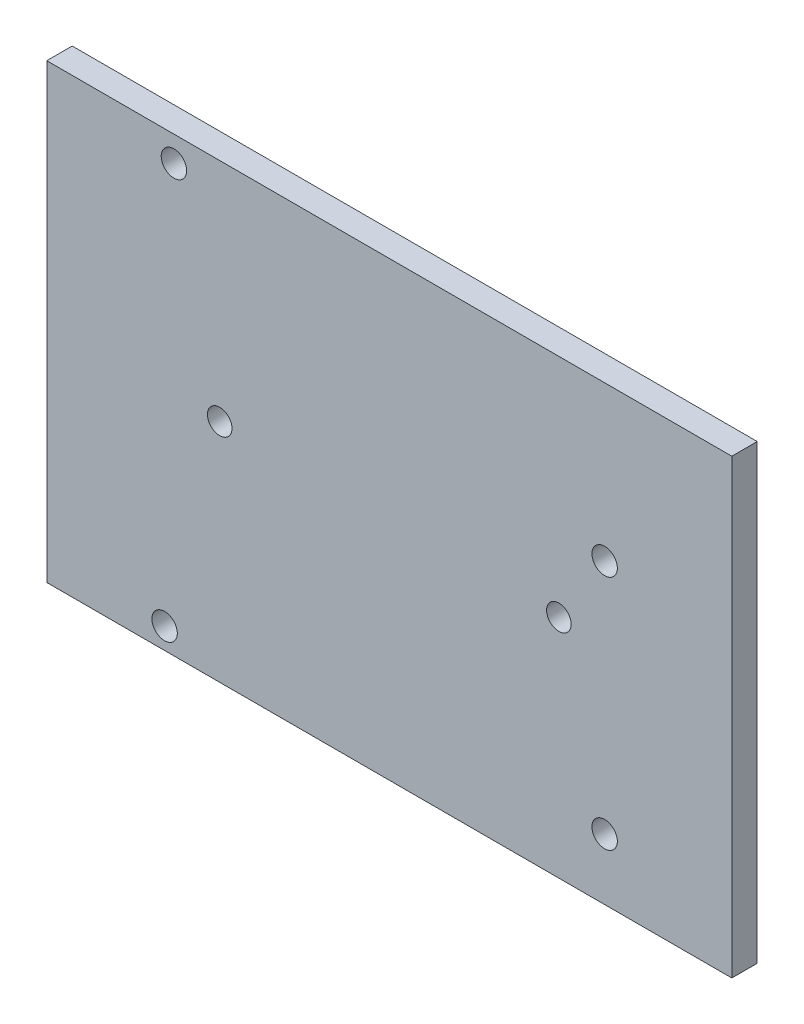
ISO-10303-21;
HEADER;
FILE_DESCRIPTION(('STEP AP214'),'2;1');
FILE_NAME('part.step','',(''),(''),'','','');
FILE_SCHEMA(('AUTOMOTIVE_DESIGN { 1 0 10303 214 1 1 1 1 }'));
ENDSEC;
DATA;
#1=APPLICATION_CONTEXT('core data for automotive mechanical design processes');
#2=APPLICATION_PROTOCOL_DEFINITION('international standard','automotive_design',2000,#1);
#3=PRODUCT_CONTEXT('',#1,'mechanical');
#4=PRODUCT('Part','Part','',(#3));
#5=PRODUCT_RELATED_PRODUCT_CATEGORY('part','',(#4));
#6=PRODUCT_DEFINITION_FORMATION('','',#4);
#7=PRODUCT_DEFINITION_CONTEXT('part definition',#1,'design');
#8=PRODUCT_DEFINITION('design','',#6,#7);
#9=PRODUCT_DEFINITION_SHAPE('','',#8);
#10=(LENGTH_UNIT() NAMED_UNIT(*) SI_UNIT(.MILLI.,.METRE.));
#11=(NAMED_UNIT(*) PLANE_ANGLE_UNIT() SI_UNIT($,.RADIAN.));
#12=(NAMED_UNIT(*) SI_UNIT($,.STERADIAN.) SOLID_ANGLE_UNIT());
#13=UNCERTAINTY_MEASURE_WITH_UNIT(LENGTH_MEASURE(1.E-05),#10,'distance_accuracy_value','');
#14=(GEOMETRIC_REPRESENTATION_CONTEXT(3) GLOBAL_UNCERTAINTY_ASSIGNED_CONTEXT((#13)) GLOBAL_UNIT_ASSIGNED_CONTEXT((#10,
#11,#12)) REPRESENTATION_CONTEXT('',''));
#15=CARTESIAN_POINT('',(0.,0.,0.));
#16=DIRECTION('',(0.,0.,1.));
#17=DIRECTION('',(1.,0.,0.));
#18=AXIS2_PLACEMENT_3D('',#15,#16,#17);
#19=CARTESIAN_POINT('',(0.,0.,3.));
#20=DIRECTION('',(0.,0.,1.));
#21=DIRECTION('',(1.,0.,0.));
#22=AXIS2_PLACEMENT_3D('',#19,#20,#21);
#23=PLANE('',#22);
#24=CARTESIAN_POINT('',(20.,0.,3.));
#25=DIRECTION('',(0.,0.,1.));
#26=DIRECTION('',(1.,0.,0.));
#27=AXIS2_PLACEMENT_3D('',#24,#25,#26);
#28=CIRCLE('',#27,1.45);
#29=CARTESIAN_POINT('',(21.45,0.,3.));
#30=VERTEX_POINT('',#29);
#31=EDGE_CURVE('E133',#30,#30,#28,.T.);
#32=ORIENTED_EDGE('',*,*,#31,.F.);
#33=EDGE_LOOP('',(#32));
#34=FACE_BOUND('',#33,.T.);
#35=CARTESIAN_POINT('',(25.4,-19.45,3.));
#36=DIRECTION('',(0.,0.,1.));
#37=DIRECTION('',(1.,0.,0.));
#38=AXIS2_PLACEMENT_3D('',#35,#36,#37);
#39=CIRCLE('',#38,1.5);
#40=CARTESIAN_POINT('',(26.9,-19.45,3.));
#41=VERTEX_POINT('',#40);
#42=EDGE_CURVE('E121',#41,#41,#39,.T.);
#43=ORIENTED_EDGE('',*,*,#42,.F.);
#44=EDGE_LOOP('',(#43));
#45=FACE_BOUND('',#44,.T.);
#46=CARTESIAN_POINT('',(-25.4,23.65,3.));
#47=DIRECTION('',(0.,0.,1.));
#48=DIRECTION('',(1.,0.,0.));
#49=AXIS2_PLACEMENT_3D('',#46,#47,#48);
#50=CIRCLE('',#49,1.5);
#51=CARTESIAN_POINT('',(-23.9,23.65,3.));
#52=VERTEX_POINT('',#51);
#53=EDGE_CURVE('E100',#52,#52,#50,.T.);
#54=ORIENTED_EDGE('',*,*,#53,.F.);
#55=EDGE_LOOP('',(#54));
#56=FACE_BOUND('',#55,.T.);
#57=DIRECTION('',(0.,-1.,0.));
#58=VECTOR('',#57,1.);
#59=CARTESIAN_POINT('',(-40.4,26.65,3.));
#60=LINE('',#59,#58);
#61=CARTESIAN_POINT('',(-40.4,26.65,3.));
#62=VERTEX_POINT('',#61);
#63=CARTESIAN_POINT('',(-40.4,-26.65,3.));
#64=VERTEX_POINT('',#63);
#65=EDGE_CURVE('E85',#62,#64,#60,.T.);
#66=ORIENTED_EDGE('',*,*,#65,.T.);
#67=DIRECTION('',(1.,0.,0.));
#68=VECTOR('',#67,1.);
#69=CARTESIAN_POINT('',(-40.4,-26.65,3.));
#70=LINE('',#69,#68);
#71=CARTESIAN_POINT('',(40.4,-26.65,3.));
#72=VERTEX_POINT('',#71);
#73=EDGE_CURVE('E80',#64,#72,#70,.T.);
#74=ORIENTED_EDGE('',*,*,#73,.T.);
#75=DIRECTION('',(0.,1.,0.));
#76=VECTOR('',#75,1.);
#77=CARTESIAN_POINT('',(40.4,26.65,3.));
#78=LINE('',#77,#76);
#79=CARTESIAN_POINT('',(40.4,26.65,3.));
#80=VERTEX_POINT('',#79);
#81=EDGE_CURVE('E83',#72,#80,#78,.T.);
#82=ORIENTED_EDGE('',*,*,#81,.T.);
#83=DIRECTION('',(-1.,0.,0.));
#84=VECTOR('',#83,1.);
#85=CARTESIAN_POINT('',(-40.4,26.65,3.));
#86=LINE('',#85,#84);
#87=EDGE_CURVE('E50',#80,#62,#86,.T.);
#88=ORIENTED_EDGE('',*,*,#87,.T.);
#89=EDGE_LOOP('',(#66,#74,#82,#88));
#90=FACE_BOUND('',#89,.T.);
#91=CARTESIAN_POINT('',(-26.5,-24.15,3.));
#92=DIRECTION('',(0.,0.,1.));
#93=DIRECTION('',(1.,0.,0.));
#94=AXIS2_PLACEMENT_3D('',#91,#92,#93);
#95=CIRCLE('',#94,1.5);
#96=CARTESIAN_POINT('',(-25.,-24.15,3.));
#97=VERTEX_POINT('',#96);
#98=EDGE_CURVE('E115',#97,#97,#95,.T.);
#99=ORIENTED_EDGE('',*,*,#98,.F.);
#100=EDGE_LOOP('',(#99));
#101=FACE_BOUND('',#100,.T.);
#102=CARTESIAN_POINT('',(25.4,8.45000000000002,3.));
#103=DIRECTION('',(0.,0.,1.));
#104=DIRECTION('',(1.,0.,0.));
#105=AXIS2_PLACEMENT_3D('',#102,#103,#104);
#106=CIRCLE('',#105,1.5);
#107=CARTESIAN_POINT('',(26.9,8.45000000000002,3.));
#108=VERTEX_POINT('',#107);
#109=EDGE_CURVE('E127',#108,#108,#106,.T.);
#110=ORIENTED_EDGE('',*,*,#109,.F.);
#111=EDGE_LOOP('',(#110));
#112=FACE_BOUND('',#111,.T.);
#113=CARTESIAN_POINT('',(-20.,0.,3.));
#114=DIRECTION('',(0.,0.,1.));
#115=DIRECTION('',(1.,0.,0.));
#116=AXIS2_PLACEMENT_3D('',#113,#114,#115);
#117=CIRCLE('',#116,1.45);
#118=CARTESIAN_POINT('',(-18.55,0.,3.));
#119=VERTEX_POINT('',#118);
#120=EDGE_CURVE('E139',#119,#119,#117,.T.);
#121=ORIENTED_EDGE('',*,*,#120,.F.);
#122=EDGE_LOOP('',(#121));
#123=FACE_BOUND('',#122,.T.);
#124=ADVANCED_FACE('F33',(#34,#45,#56,#90,#101,#112,#123),#23,.T.);
#125=CARTESIAN_POINT('',(0.,0.,0.));
#126=DIRECTION('',(0.,0.,1.));
#127=DIRECTION('',(1.,0.,0.));
#128=AXIS2_PLACEMENT_3D('',#125,#126,#127);
#129=PLANE('',#128);
#130=DIRECTION('',(0.,-1.,0.));
#131=VECTOR('',#130,1.);
#132=CARTESIAN_POINT('',(-40.4,26.65,0.));
#133=LINE('',#132,#131);
#134=CARTESIAN_POINT('',(-40.4,26.65,0.));
#135=VERTEX_POINT('',#134);
#136=CARTESIAN_POINT('',(-40.4,-26.65,0.));
#137=VERTEX_POINT('',#136);
#138=EDGE_CURVE('E97',#135,#137,#133,.T.);
#139=ORIENTED_EDGE('',*,*,#138,.F.);
#140=DIRECTION('',(-1.,0.,0.));
#141=VECTOR('',#140,1.);
#142=CARTESIAN_POINT('',(-40.4,26.65,0.));
#143=LINE('',#142,#141);
#144=CARTESIAN_POINT('',(40.4,26.65,0.));
#145=VERTEX_POINT('',#144);
#146=EDGE_CURVE('E73',#145,#135,#143,.T.);
#147=ORIENTED_EDGE('',*,*,#146,.F.);
#148=DIRECTION('',(0.,1.,0.));
#149=VECTOR('',#148,1.);
#150=CARTESIAN_POINT('',(40.4,26.65,0.));
#151=LINE('',#150,#149);
#152=CARTESIAN_POINT('',(40.4,-26.65,0.));
#153=VERTEX_POINT('',#152);
#154=EDGE_CURVE('E67',#153,#145,#151,.T.);
#155=ORIENTED_EDGE('',*,*,#154,.F.);
#156=DIRECTION('',(1.,0.,0.));
#157=VECTOR('',#156,1.);
#158=CARTESIAN_POINT('',(-40.4,-26.65,0.));
#159=LINE('',#158,#157);
#160=EDGE_CURVE('E89',#137,#153,#159,.T.);
#161=ORIENTED_EDGE('',*,*,#160,.F.);
#162=EDGE_LOOP('',(#139,#147,#155,#161));
#163=FACE_BOUND('',#162,.T.);
#164=CARTESIAN_POINT('',(-25.4,23.65,0.));
#165=DIRECTION('',(0.,0.,1.));
#166=DIRECTION('',(1.,0.,0.));
#167=AXIS2_PLACEMENT_3D('',#164,#165,#166);
#168=CIRCLE('',#167,1.5);
#169=CARTESIAN_POINT('',(-23.9,23.65,0.));
#170=VERTEX_POINT('',#169);
#171=EDGE_CURVE('E112',#170,#170,#168,.T.);
#172=ORIENTED_EDGE('',*,*,#171,.T.);
#173=EDGE_LOOP('',(#172));
#174=FACE_BOUND('',#173,.T.);
#175=CARTESIAN_POINT('',(-26.5,-24.15,0.));
#176=DIRECTION('',(0.,0.,1.));
#177=DIRECTION('',(1.,0.,0.));
#178=AXIS2_PLACEMENT_3D('',#175,#176,#177);
#179=CIRCLE('',#178,1.5);
#180=CARTESIAN_POINT('',(-25.,-24.15,0.));
#181=VERTEX_POINT('',#180);
#182=EDGE_CURVE('E118',#181,#181,#179,.T.);
#183=ORIENTED_EDGE('',*,*,#182,.T.);
#184=EDGE_LOOP('',(#183));
#185=FACE_BOUND('',#184,.T.);
#186=CARTESIAN_POINT('',(25.4,-19.45,0.));
#187=DIRECTION('',(0.,0.,1.));
#188=DIRECTION('',(1.,0.,0.));
#189=AXIS2_PLACEMENT_3D('',#186,#187,#188);
#190=CIRCLE('',#189,1.5);
#191=CARTESIAN_POINT('',(26.9,-19.45,0.));
#192=VERTEX_POINT('',#191);
#193=EDGE_CURVE('E124',#192,#192,#190,.T.);
#194=ORIENTED_EDGE('',*,*,#193,.T.);
#195=EDGE_LOOP('',(#194));
#196=FACE_BOUND('',#195,.T.);
#197=CARTESIAN_POINT('',(25.4,8.45000000000002,0.));
#198=DIRECTION('',(0.,0.,1.));
#199=DIRECTION('',(1.,0.,0.));
#200=AXIS2_PLACEMENT_3D('',#197,#198,#199);
#201=CIRCLE('',#200,1.5);
#202=CARTESIAN_POINT('',(26.9,8.45000000000002,0.));
#203=VERTEX_POINT('',#202);
#204=EDGE_CURVE('E130',#203,#203,#201,.T.);
#205=ORIENTED_EDGE('',*,*,#204,.T.);
#206=EDGE_LOOP('',(#205));
#207=FACE_BOUND('',#206,.T.);
#208=CARTESIAN_POINT('',(20.,0.,0.));
#209=DIRECTION('',(0.,0.,1.));
#210=DIRECTION('',(1.,0.,0.));
#211=AXIS2_PLACEMENT_3D('',#208,#209,#210);
#212=CIRCLE('',#211,1.45);
#213=CARTESIAN_POINT('',(21.45,0.,0.));
#214=VERTEX_POINT('',#213);
#215=EDGE_CURVE('E136',#214,#214,#212,.T.);
#216=ORIENTED_EDGE('',*,*,#215,.T.);
#217=EDGE_LOOP('',(#216));
#218=FACE_BOUND('',#217,.T.);
#219=CARTESIAN_POINT('',(-20.,0.,0.));
#220=DIRECTION('',(0.,0.,1.));
#221=DIRECTION('',(1.,0.,0.));
#222=AXIS2_PLACEMENT_3D('',#219,#220,#221);
#223=CIRCLE('',#222,1.45);
#224=CARTESIAN_POINT('',(-18.55,0.,0.));
#225=VERTEX_POINT('',#224);
#226=EDGE_CURVE('E142',#225,#225,#223,.T.);
#227=ORIENTED_EDGE('',*,*,#226,.T.);
#228=EDGE_LOOP('',(#227));
#229=FACE_BOUND('',#228,.T.);
#230=ADVANCED_FACE('F108',(#163,#174,#185,#196,#207,#218,#229),#129,.F.);
#231=CARTESIAN_POINT('',(-40.4,26.65,3.));
#232=DIRECTION('',(1.,0.,0.));
#233=DIRECTION('',(0.,1.,0.));
#234=AXIS2_PLACEMENT_3D('',#231,#232,#233);
#235=PLANE('',#234);
#236=ORIENTED_EDGE('',*,*,#138,.T.);
#237=DIRECTION('',(0.,0.,-1.));
#238=VECTOR('',#237,1.);
#239=CARTESIAN_POINT('',(-40.4,-26.65,3.));
#240=LINE('',#239,#238);
#241=EDGE_CURVE('E11',#64,#137,#240,.T.);
#242=ORIENTED_EDGE('',*,*,#241,.F.);
#243=ORIENTED_EDGE('',*,*,#65,.F.);
#244=DIRECTION('',(0.,0.,-1.));
#245=VECTOR('',#244,1.);
#246=CARTESIAN_POINT('',(-40.4,26.65,3.));
#247=LINE('',#246,#245);
#248=EDGE_CURVE('E93',#62,#135,#247,.T.);
#249=ORIENTED_EDGE('',*,*,#248,.T.);
#250=EDGE_LOOP('',(#236,#242,#243,#249));
#251=FACE_BOUND('',#250,.T.);
#252=ADVANCED_FACE('F35',(#251),#235,.F.);
#253=CARTESIAN_POINT('',(-40.4,-26.65,3.));
#254=DIRECTION('',(0.,1.,0.));
#255=DIRECTION('',(-1.,0.,0.));
#256=AXIS2_PLACEMENT_3D('',#253,#254,#255);
#257=PLANE('',#256);
#258=ORIENTED_EDGE('',*,*,#160,.T.);
#259=DIRECTION('',(0.,0.,-1.));
#260=VECTOR('',#259,1.);
#261=CARTESIAN_POINT('',(40.4,-26.65,3.));
#262=LINE('',#261,#260);
#263=EDGE_CURVE('E42',#72,#153,#262,.T.);
#264=ORIENTED_EDGE('',*,*,#263,.F.);
#265=ORIENTED_EDGE('',*,*,#73,.F.);
#266=ORIENTED_EDGE('',*,*,#241,.T.);
#267=EDGE_LOOP('',(#258,#264,#265,#266));
#268=FACE_BOUND('',#267,.T.);
#269=ADVANCED_FACE('F88',(#268),#257,.F.);
#270=CARTESIAN_POINT('',(40.4,26.65,3.));
#271=DIRECTION('',(-1.,0.,0.));
#272=DIRECTION('',(0.,0.,1.));
#273=AXIS2_PLACEMENT_3D('',#270,#271,#272);
#274=PLANE('',#273);
#275=ORIENTED_EDGE('',*,*,#154,.T.);
#276=DIRECTION('',(0.,0.,-1.));
#277=VECTOR('',#276,1.);
#278=CARTESIAN_POINT('',(40.4,26.65,3.));
#279=LINE('',#278,#277);
#280=EDGE_CURVE('E90',#80,#145,#279,.T.);
#281=ORIENTED_EDGE('',*,*,#280,.F.);
#282=ORIENTED_EDGE('',*,*,#81,.F.);
#283=ORIENTED_EDGE('',*,*,#263,.T.);
#284=EDGE_LOOP('',(#275,#281,#282,#283));
#285=FACE_BOUND('',#284,.T.);
#286=ADVANCED_FACE('F91',(#285),#274,.F.);
#287=CARTESIAN_POINT('',(-40.4,26.65,3.));
#288=DIRECTION('',(0.,-1.,0.));
#289=DIRECTION('',(0.,0.,-1.));
#290=AXIS2_PLACEMENT_3D('',#287,#288,#289);
#291=PLANE('',#290);
#292=ORIENTED_EDGE('',*,*,#146,.T.);
#293=ORIENTED_EDGE('',*,*,#248,.F.);
#294=ORIENTED_EDGE('',*,*,#87,.F.);
#295=ORIENTED_EDGE('',*,*,#280,.T.);
#296=EDGE_LOOP('',(#292,#293,#294,#295));
#297=FACE_BOUND('',#296,.T.);
#298=ADVANCED_FACE('F105',(#297),#291,.F.);
#299=CARTESIAN_POINT('',(-25.4,23.65,3.));
#300=DIRECTION('',(0.,0.,-1.));
#301=DIRECTION('',(-1.,0.,0.));
#302=AXIS2_PLACEMENT_3D('',#299,#300,#301);
#303=CYLINDRICAL_SURFACE('',#302,1.5);
#304=ORIENTED_EDGE('',*,*,#53,.T.);
#305=EDGE_LOOP('',(#304));
#306=FACE_BOUND('',#305,.T.);
#307=ORIENTED_EDGE('',*,*,#171,.F.);
#308=EDGE_LOOP('',(#307));
#309=FACE_BOUND('',#308,.T.);
#310=ADVANCED_FACE('F161',(#306,#309),#303,.F.);
#311=CARTESIAN_POINT('',(-26.5,-24.15,3.));
#312=DIRECTION('',(0.,0.,-1.));
#313=DIRECTION('',(-1.,0.,0.));
#314=AXIS2_PLACEMENT_3D('',#311,#312,#313);
#315=CYLINDRICAL_SURFACE('',#314,1.5);
#316=ORIENTED_EDGE('',*,*,#98,.T.);
#317=EDGE_LOOP('',(#316));
#318=FACE_BOUND('',#317,.T.);
#319=ORIENTED_EDGE('',*,*,#182,.F.);
#320=EDGE_LOOP('',(#319));
#321=FACE_BOUND('',#320,.T.);
#322=ADVANCED_FACE('F207',(#318,#321),#315,.F.);
#323=CARTESIAN_POINT('',(25.4,-19.45,3.));
#324=DIRECTION('',(0.,0.,-1.));
#325=DIRECTION('',(-1.,0.,0.));
#326=AXIS2_PLACEMENT_3D('',#323,#324,#325);
#327=CYLINDRICAL_SURFACE('',#326,1.5);
#328=ORIENTED_EDGE('',*,*,#42,.T.);
#329=EDGE_LOOP('',(#328));
#330=FACE_BOUND('',#329,.T.);
#331=ORIENTED_EDGE('',*,*,#193,.F.);
#332=EDGE_LOOP('',(#331));
#333=FACE_BOUND('',#332,.T.);
#334=ADVANCED_FACE('F215',(#330,#333),#327,.F.);
#335=CARTESIAN_POINT('',(25.4,8.45000000000002,3.));
#336=DIRECTION('',(0.,0.,-1.));
#337=DIRECTION('',(-1.,0.,0.));
#338=AXIS2_PLACEMENT_3D('',#335,#336,#337);
#339=CYLINDRICAL_SURFACE('',#338,1.5);
#340=ORIENTED_EDGE('',*,*,#109,.T.);
#341=EDGE_LOOP('',(#340));
#342=FACE_BOUND('',#341,.T.);
#343=ORIENTED_EDGE('',*,*,#204,.F.);
#344=EDGE_LOOP('',(#343));
#345=FACE_BOUND('',#344,.T.);
#346=ADVANCED_FACE('F223',(#342,#345),#339,.F.);
#347=CARTESIAN_POINT('',(20.,0.,3.));
#348=DIRECTION('',(0.,0.,-1.));
#349=DIRECTION('',(-1.,0.,0.));
#350=AXIS2_PLACEMENT_3D('',#347,#348,#349);
#351=CYLINDRICAL_SURFACE('',#350,1.45);
#352=ORIENTED_EDGE('',*,*,#31,.T.);
#353=EDGE_LOOP('',(#352));
#354=FACE_BOUND('',#353,.T.);
#355=ORIENTED_EDGE('',*,*,#215,.F.);
#356=EDGE_LOOP('',(#355));
#357=FACE_BOUND('',#356,.T.);
#358=ADVANCED_FACE('F232',(#354,#357),#351,.F.);
#359=CARTESIAN_POINT('',(-20.,0.,3.));
#360=DIRECTION('',(0.,0.,-1.));
#361=DIRECTION('',(-1.,0.,0.));
#362=AXIS2_PLACEMENT_3D('',#359,#360,#361);
#363=CYLINDRICAL_SURFACE('',#362,1.45);
#364=ORIENTED_EDGE('',*,*,#120,.T.);
#365=EDGE_LOOP('',(#364));
#366=FACE_BOUND('',#365,.T.);
#367=ORIENTED_EDGE('',*,*,#226,.F.);
#368=EDGE_LOOP('',(#367));
#369=FACE_BOUND('',#368,.T.);
#370=ADVANCED_FACE('F148',(#366,#369),#363,.F.);
#371=CLOSED_SHELL('',(#124,#230,#252,#269,#286,#298,#310,#322,#334,#346,#358,#370));
#372=MANIFOLD_SOLID_BREP('B2',#371);
#373=ADVANCED_BREP_SHAPE_REPRESENTATION('',(#18,#372),#14);
#374=SHAPE_DEFINITION_REPRESENTATION(#9,#373);
ENDSEC;
END-ISO-10303-21;
